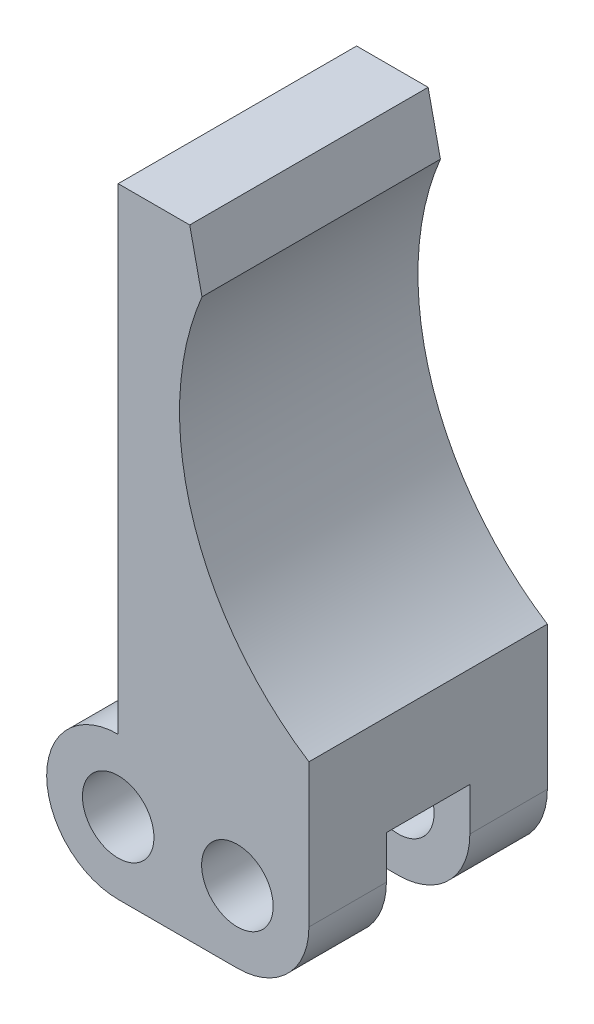
ISO-10303-21;
HEADER;
FILE_DESCRIPTION(('STEP AP214'),'2;1');
FILE_NAME('part.step','',(''),(''),'','','');
FILE_SCHEMA(('AUTOMOTIVE_DESIGN { 1 0 10303 214 1 1 1 1 }'));
ENDSEC;
DATA;
#1=APPLICATION_CONTEXT('core data for automotive mechanical design processes');
#2=APPLICATION_PROTOCOL_DEFINITION('international standard','automotive_design',2000,#1);
#3=PRODUCT_CONTEXT('',#1,'mechanical');
#4=PRODUCT('Part','Part','',(#3));
#5=PRODUCT_RELATED_PRODUCT_CATEGORY('part','',(#4));
#6=PRODUCT_DEFINITION_FORMATION('','',#4);
#7=PRODUCT_DEFINITION_CONTEXT('part definition',#1,'design');
#8=PRODUCT_DEFINITION('design','',#6,#7);
#9=PRODUCT_DEFINITION_SHAPE('','',#8);
#10=(LENGTH_UNIT() NAMED_UNIT(*) SI_UNIT(.MILLI.,.METRE.));
#11=(NAMED_UNIT(*) PLANE_ANGLE_UNIT() SI_UNIT($,.RADIAN.));
#12=(NAMED_UNIT(*) SI_UNIT($,.STERADIAN.) SOLID_ANGLE_UNIT());
#13=UNCERTAINTY_MEASURE_WITH_UNIT(LENGTH_MEASURE(1.E-05),#10,'distance_accuracy_value','');
#14=(GEOMETRIC_REPRESENTATION_CONTEXT(3) GLOBAL_UNCERTAINTY_ASSIGNED_CONTEXT((#13)) GLOBAL_UNIT_ASSIGNED_CONTEXT((#10,
#11,#12)) REPRESENTATION_CONTEXT('',''));
#15=CARTESIAN_POINT('',(0.,0.,0.));
#16=DIRECTION('',(0.,0.,1.));
#17=DIRECTION('',(1.,0.,0.));
#18=AXIS2_PLACEMENT_3D('',#15,#16,#17);
#19=CARTESIAN_POINT('',(0.,3.,5.));
#20=DIRECTION('',(1.,0.,0.));
#21=DIRECTION('',(0.,0.,-1.));
#22=AXIS2_PLACEMENT_3D('',#19,#20,#21);
#23=PLANE('',#22);
#24=DIRECTION('',(0.,-1.,0.));
#25=VECTOR('',#24,1.);
#26=CARTESIAN_POINT('',(0.,3.,-1.75));
#27=LINE('',#26,#25);
#28=CARTESIAN_POINT('',(0.,3.5,-1.75));
#29=VERTEX_POINT('',#28);
#30=CARTESIAN_POINT('',(0.,3.,-1.75));
#31=VERTEX_POINT('',#30);
#32=EDGE_CURVE('E219',#29,#31,#27,.T.);
#33=ORIENTED_EDGE('',*,*,#32,.F.);
#34=DIRECTION('',(0.,0.,1.));
#35=VECTOR('',#34,1.);
#36=CARTESIAN_POINT('',(0.,3.5,-1.75));
#37=LINE('',#36,#35);
#38=CARTESIAN_POINT('',(0.,3.5,1.75));
#39=VERTEX_POINT('',#38);
#40=EDGE_CURVE('E247',#29,#39,#37,.T.);
#41=ORIENTED_EDGE('',*,*,#40,.T.);
#42=DIRECTION('',(0.,-1.,0.));
#43=VECTOR('',#42,1.);
#44=CARTESIAN_POINT('',(0.,3.,1.75));
#45=LINE('',#44,#43);
#46=CARTESIAN_POINT('',(0.,3.,1.75));
#47=VERTEX_POINT('',#46);
#48=EDGE_CURVE('E236',#39,#47,#45,.T.);
#49=ORIENTED_EDGE('',*,*,#48,.T.);
#50=DIRECTION('',(0.,0.,-1.));
#51=VECTOR('',#50,1.);
#52=CARTESIAN_POINT('',(0.,3.,5.));
#53=LINE('',#52,#51);
#54=CARTESIAN_POINT('',(0.,3.,5.));
#55=VERTEX_POINT('',#54);
#56=EDGE_CURVE('E173',#55,#47,#53,.T.);
#57=ORIENTED_EDGE('',*,*,#56,.F.);
#58=DIRECTION('',(0.,-1.,0.));
#59=VECTOR('',#58,1.);
#60=CARTESIAN_POINT('',(0.,3.,5.));
#61=LINE('',#60,#59);
#62=CARTESIAN_POINT('',(0.,23.,5.));
#63=VERTEX_POINT('',#62);
#64=EDGE_CURVE('E202',#63,#55,#61,.T.);
#65=ORIENTED_EDGE('',*,*,#64,.F.);
#66=DIRECTION('',(0.,0.,-1.));
#67=VECTOR('',#66,1.);
#68=CARTESIAN_POINT('',(0.,23.,5.));
#69=LINE('',#68,#67);
#70=CARTESIAN_POINT('',(0.,23.,-5.));
#71=VERTEX_POINT('',#70);
#72=EDGE_CURVE('E176',#63,#71,#69,.T.);
#73=ORIENTED_EDGE('',*,*,#72,.T.);
#74=DIRECTION('',(0.,-1.,0.));
#75=VECTOR('',#74,1.);
#76=CARTESIAN_POINT('',(0.,3.,-5.));
#77=LINE('',#76,#75);
#78=CARTESIAN_POINT('',(0.,3.,-5.));
#79=VERTEX_POINT('',#78);
#80=EDGE_CURVE('E153',#71,#79,#77,.T.);
#81=ORIENTED_EDGE('',*,*,#80,.T.);
#82=EDGE_CURVE('E172',#31,#79,#53,.T.);
#83=ORIENTED_EDGE('',*,*,#82,.F.);
#84=EDGE_LOOP('',(#33,#41,#49,#57,#65,#73,#81,#83));
#85=FACE_BOUND('',#84,.T.);
#86=ADVANCED_FACE('F32',(#85),#23,.F.);
#87=CARTESIAN_POINT('',(0.,0.,5.));
#88=DIRECTION('',(0.,0.,-1.));
#89=DIRECTION('',(-1.,0.,0.));
#90=AXIS2_PLACEMENT_3D('',#87,#88,#89);
#91=CYLINDRICAL_SURFACE('',#90,3.);
#92=CARTESIAN_POINT('',(0.,0.,-1.75));
#93=DIRECTION('',(0.,0.,1.));
#94=DIRECTION('',(1.,0.,0.));
#95=AXIS2_PLACEMENT_3D('',#92,#93,#94);
#96=CIRCLE('',#95,3.);
#97=CARTESIAN_POINT('',(0.,-3.,-1.75));
#98=VERTEX_POINT('',#97);
#99=EDGE_CURVE('E224',#31,#98,#96,.T.);
#100=ORIENTED_EDGE('',*,*,#99,.F.);
#101=ORIENTED_EDGE('',*,*,#82,.T.);
#102=CARTESIAN_POINT('',(0.,0.,-5.));
#103=DIRECTION('',(0.,0.,1.));
#104=DIRECTION('',(1.,0.,0.));
#105=AXIS2_PLACEMENT_3D('',#102,#103,#104);
#106=CIRCLE('',#105,3.);
#107=CARTESIAN_POINT('',(0.,-3.,-5.));
#108=VERTEX_POINT('',#107);
#109=EDGE_CURVE('E156',#79,#108,#106,.T.);
#110=ORIENTED_EDGE('',*,*,#109,.T.);
#111=DIRECTION('',(0.,0.,-1.));
#112=VECTOR('',#111,1.);
#113=CARTESIAN_POINT('',(0.,-3.,5.));
#114=LINE('',#113,#112);
#115=EDGE_CURVE('E134',#98,#108,#114,.T.);
#116=ORIENTED_EDGE('',*,*,#115,.F.);
#117=EDGE_LOOP('',(#100,#101,#110,#116));
#118=FACE_BOUND('',#117,.T.);
#119=ADVANCED_FACE('F292',(#118),#91,.T.);
#120=CARTESIAN_POINT('',(0.,-3.,5.));
#121=DIRECTION('',(0.,1.,0.));
#122=DIRECTION('',(-1.,0.,0.));
#123=AXIS2_PLACEMENT_3D('',#120,#121,#122);
#124=PLANE('',#123);
#125=DIRECTION('',(1.,0.,0.));
#126=VECTOR('',#125,1.);
#127=CARTESIAN_POINT('',(0.,-3.,-1.75));
#128=LINE('',#127,#126);
#129=CARTESIAN_POINT('',(5.,-3.,-1.75));
#130=VERTEX_POINT('',#129);
#131=EDGE_CURVE('E227',#98,#130,#128,.T.);
#132=ORIENTED_EDGE('',*,*,#131,.F.);
#133=ORIENTED_EDGE('',*,*,#115,.T.);
#134=DIRECTION('',(1.,0.,0.));
#135=VECTOR('',#134,1.);
#136=CARTESIAN_POINT('',(0.,-3.,-5.));
#137=LINE('',#136,#135);
#138=CARTESIAN_POINT('',(5.,-3.,-5.));
#139=VERTEX_POINT('',#138);
#140=EDGE_CURVE('E159',#108,#139,#137,.T.);
#141=ORIENTED_EDGE('',*,*,#140,.T.);
#142=DIRECTION('',(0.,0.,-1.));
#143=VECTOR('',#142,1.);
#144=CARTESIAN_POINT('',(5.,-3.,5.));
#145=LINE('',#144,#143);
#146=EDGE_CURVE('E135',#130,#139,#145,.T.);
#147=ORIENTED_EDGE('',*,*,#146,.F.);
#148=EDGE_LOOP('',(#132,#133,#141,#147));
#149=FACE_BOUND('',#148,.T.);
#150=ADVANCED_FACE('F296',(#149),#124,.F.);
#151=CARTESIAN_POINT('',(5.,0.,5.));
#152=DIRECTION('',(0.,0.,-1.));
#153=DIRECTION('',(-1.,0.,0.));
#154=AXIS2_PLACEMENT_3D('',#151,#152,#153);
#155=CYLINDRICAL_SURFACE('',#154,3.);
#156=CARTESIAN_POINT('',(5.,0.,-1.75));
#157=DIRECTION('',(0.,0.,1.));
#158=DIRECTION('',(1.,0.,0.));
#159=AXIS2_PLACEMENT_3D('',#156,#157,#158);
#160=CIRCLE('',#159,3.);
#161=CARTESIAN_POINT('',(8.,0.,-1.75));
#162=VERTEX_POINT('',#161);
#163=EDGE_CURVE('E230',#130,#162,#160,.T.);
#164=ORIENTED_EDGE('',*,*,#163,.F.);
#165=ORIENTED_EDGE('',*,*,#146,.T.);
#166=CARTESIAN_POINT('',(5.,0.,-5.));
#167=DIRECTION('',(0.,0.,1.));
#168=DIRECTION('',(1.,0.,0.));
#169=AXIS2_PLACEMENT_3D('',#166,#167,#168);
#170=CIRCLE('',#169,3.);
#171=CARTESIAN_POINT('',(8.,0.,-5.));
#172=VERTEX_POINT('',#171);
#173=EDGE_CURVE('E162',#139,#172,#170,.T.);
#174=ORIENTED_EDGE('',*,*,#173,.T.);
#175=DIRECTION('',(0.,0.,-1.));
#176=VECTOR('',#175,1.);
#177=CARTESIAN_POINT('',(8.,0.,5.));
#178=LINE('',#177,#176);
#179=EDGE_CURVE('E168',#162,#172,#178,.T.);
#180=ORIENTED_EDGE('',*,*,#179,.F.);
#181=EDGE_LOOP('',(#164,#165,#174,#180));
#182=FACE_BOUND('',#181,.T.);
#183=ADVANCED_FACE('F304',(#182),#155,.T.);
#184=CARTESIAN_POINT('',(8.,0.,5.));
#185=DIRECTION('',(-1.,0.,0.));
#186=DIRECTION('',(0.,0.,1.));
#187=AXIS2_PLACEMENT_3D('',#184,#185,#186);
#188=PLANE('',#187);
#189=DIRECTION('',(0.,1.,0.));
#190=VECTOR('',#189,1.);
#191=CARTESIAN_POINT('',(8.,0.,-1.75));
#192=LINE('',#191,#190);
#193=CARTESIAN_POINT('',(8.,1.802775637732,-1.75));
#194=VERTEX_POINT('',#193);
#195=EDGE_CURVE('E233',#162,#194,#192,.T.);
#196=ORIENTED_EDGE('',*,*,#195,.F.);
#197=ORIENTED_EDGE('',*,*,#179,.T.);
#198=DIRECTION('',(0.,1.,0.));
#199=VECTOR('',#198,1.);
#200=CARTESIAN_POINT('',(8.,0.,-5.));
#201=LINE('',#200,#199);
#202=CARTESIAN_POINT('',(8.,6.,-5.));
#203=VERTEX_POINT('',#202);
#204=EDGE_CURVE('E88',#172,#203,#201,.T.);
#205=ORIENTED_EDGE('',*,*,#204,.T.);
#206=DIRECTION('',(0.,0.,-1.));
#207=VECTOR('',#206,1.);
#208=CARTESIAN_POINT('',(8.,6.,5.));
#209=LINE('',#208,#207);
#210=CARTESIAN_POINT('',(8.,6.,5.));
#211=VERTEX_POINT('',#210);
#212=EDGE_CURVE('E141',#211,#203,#209,.T.);
#213=ORIENTED_EDGE('',*,*,#212,.F.);
#214=DIRECTION('',(0.,1.,0.));
#215=VECTOR('',#214,1.);
#216=CARTESIAN_POINT('',(8.,0.,5.));
#217=LINE('',#216,#215);
#218=CARTESIAN_POINT('',(8.,0.,5.));
#219=VERTEX_POINT('',#218);
#220=EDGE_CURVE('E56',#219,#211,#217,.T.);
#221=ORIENTED_EDGE('',*,*,#220,.F.);
#222=CARTESIAN_POINT('',(8.,0.,1.75));
#223=VERTEX_POINT('',#222);
#224=EDGE_CURVE('E139',#219,#223,#178,.T.);
#225=ORIENTED_EDGE('',*,*,#224,.T.);
#226=DIRECTION('',(0.,1.,0.));
#227=VECTOR('',#226,1.);
#228=CARTESIAN_POINT('',(8.,0.,1.75));
#229=LINE('',#228,#227);
#230=CARTESIAN_POINT('',(8.,1.802775637732,1.75));
#231=VERTEX_POINT('',#230);
#232=EDGE_CURVE('E244',#223,#231,#229,.T.);
#233=ORIENTED_EDGE('',*,*,#232,.T.);
#234=DIRECTION('',(0.,0.,1.));
#235=VECTOR('',#234,1.);
#236=CARTESIAN_POINT('',(8.,1.802775637732,-1.75));
#237=LINE('',#236,#235);
#238=EDGE_CURVE('E11',#231,#194,#237,.F.);
#239=ORIENTED_EDGE('',*,*,#238,.T.);
#240=EDGE_LOOP('',(#196,#197,#205,#213,#221,#225,#233,#239));
#241=FACE_BOUND('',#240,.T.);
#242=ADVANCED_FACE('F307',(#241),#188,.F.);
#243=CARTESIAN_POINT('',(0.,0.,5.));
#244=DIRECTION('',(0.,0.,-1.));
#245=DIRECTION('',(-1.,0.,0.));
#246=AXIS2_PLACEMENT_3D('',#243,#244,#245);
#247=CYLINDRICAL_SURFACE('',#246,1.5);
#248=CARTESIAN_POINT('',(0.,0.,-5.));
#249=DIRECTION('',(0.,0.,1.));
#250=DIRECTION('',(1.,0.,0.));
#251=AXIS2_PLACEMENT_3D('',#248,#249,#250);
#252=CIRCLE('',#251,1.5);
#253=CARTESIAN_POINT('',(1.5,0.,-5.));
#254=VERTEX_POINT('',#253);
#255=EDGE_CURVE('E210',#254,#254,#252,.T.);
#256=ORIENTED_EDGE('',*,*,#255,.F.);
#257=EDGE_LOOP('',(#256));
#258=FACE_BOUND('',#257,.T.);
#259=CARTESIAN_POINT('',(0.,0.,-1.75));
#260=DIRECTION('',(0.,0.,1.));
#261=DIRECTION('',(1.,0.,0.));
#262=AXIS2_PLACEMENT_3D('',#259,#260,#261);
#263=CIRCLE('',#262,1.5);
#264=CARTESIAN_POINT('',(1.5,0.,-1.75));
#265=VERTEX_POINT('',#264);
#266=EDGE_CURVE('E259',#265,#265,#263,.T.);
#267=ORIENTED_EDGE('',*,*,#266,.T.);
#268=EDGE_LOOP('',(#267));
#269=FACE_BOUND('',#268,.T.);
#270=ADVANCED_FACE('F365',(#258,#269),#247,.F.);
#271=CARTESIAN_POINT('',(5.,0.,5.));
#272=DIRECTION('',(0.,0.,-1.));
#273=DIRECTION('',(-1.,0.,0.));
#274=AXIS2_PLACEMENT_3D('',#271,#272,#273);
#275=CYLINDRICAL_SURFACE('',#274,1.5);
#276=CARTESIAN_POINT('',(5.,0.,-5.));
#277=DIRECTION('',(0.,0.,1.));
#278=DIRECTION('',(1.,0.,0.));
#279=AXIS2_PLACEMENT_3D('',#276,#277,#278);
#280=CIRCLE('',#279,1.5);
#281=CARTESIAN_POINT('',(6.5,0.,-5.));
#282=VERTEX_POINT('',#281);
#283=EDGE_CURVE('E216',#282,#282,#280,.T.);
#284=ORIENTED_EDGE('',*,*,#283,.F.);
#285=EDGE_LOOP('',(#284));
#286=FACE_BOUND('',#285,.T.);
#287=CARTESIAN_POINT('',(5.,0.,-1.75));
#288=DIRECTION('',(0.,0.,1.));
#289=DIRECTION('',(1.,0.,0.));
#290=AXIS2_PLACEMENT_3D('',#287,#288,#289);
#291=CIRCLE('',#290,1.5);
#292=CARTESIAN_POINT('',(6.5,0.,-1.75));
#293=VERTEX_POINT('',#292);
#294=EDGE_CURVE('E267',#293,#293,#291,.T.);
#295=ORIENTED_EDGE('',*,*,#294,.T.);
#296=EDGE_LOOP('',(#295));
#297=FACE_BOUND('',#296,.T.);
#298=ADVANCED_FACE('F276',(#286,#297),#275,.F.);
#299=CARTESIAN_POINT('',(14.5,16.,5.));
#300=DIRECTION('',(0.,0.,-1.));
#301=DIRECTION('',(-1.,0.,0.));
#302=AXIS2_PLACEMENT_3D('',#299,#300,#301);
#303=PLANE('',#302);
#304=CARTESIAN_POINT('',(0.,0.,5.));
#305=DIRECTION('',(0.,0.,1.));
#306=DIRECTION('',(1.,0.,0.));
#307=AXIS2_PLACEMENT_3D('',#304,#305,#306);
#308=CIRCLE('',#307,1.5);
#309=CARTESIAN_POINT('',(1.5,0.,5.));
#310=VERTEX_POINT('',#309);
#311=EDGE_CURVE('E149',#310,#310,#308,.T.);
#312=ORIENTED_EDGE('',*,*,#311,.F.);
#313=EDGE_LOOP('',(#312));
#314=FACE_BOUND('',#313,.T.);
#315=CARTESIAN_POINT('',(14.5,16.,5.));
#316=DIRECTION('',(0.,0.,-1.));
#317=DIRECTION('',(-1.,0.,0.));
#318=AXIS2_PLACEMENT_3D('',#315,#316,#317);
#319=CIRCLE('',#318,11.9268604418766);
#320=CARTESIAN_POINT('',(3.51533248139818,20.6461897836587,5.));
#321=VERTEX_POINT('',#320);
#322=EDGE_CURVE('E166',#211,#321,#319,.T.);
#323=ORIENTED_EDGE('',*,*,#322,.T.);
#324=DIRECTION('',(-0.213869754732396,0.976862184758272,0.));
#325=VECTOR('',#324,1.);
#326=CARTESIAN_POINT('',(3.,23.,5.));
#327=LINE('',#326,#325);
#328=CARTESIAN_POINT('',(3.,23.,5.));
#329=VERTEX_POINT('',#328);
#330=EDGE_CURVE('E97',#321,#329,#327,.T.);
#331=ORIENTED_EDGE('',*,*,#330,.T.);
#332=DIRECTION('',(-1.,0.,0.));
#333=VECTOR('',#332,1.);
#334=CARTESIAN_POINT('',(0.,23.,5.));
#335=LINE('',#334,#333);
#336=EDGE_CURVE('E204',#329,#63,#335,.T.);
#337=ORIENTED_EDGE('',*,*,#336,.T.);
#338=ORIENTED_EDGE('',*,*,#64,.T.);
#339=CARTESIAN_POINT('',(0.,0.,5.));
#340=DIRECTION('',(0.,0.,1.));
#341=DIRECTION('',(1.,0.,0.));
#342=AXIS2_PLACEMENT_3D('',#339,#340,#341);
#343=CIRCLE('',#342,3.);
#344=CARTESIAN_POINT('',(0.,-3.,5.));
#345=VERTEX_POINT('',#344);
#346=EDGE_CURVE('E120',#55,#345,#343,.T.);
#347=ORIENTED_EDGE('',*,*,#346,.T.);
#348=DIRECTION('',(1.,0.,0.));
#349=VECTOR('',#348,1.);
#350=CARTESIAN_POINT('',(0.,-3.,5.));
#351=LINE('',#350,#349);
#352=CARTESIAN_POINT('',(5.,-3.,5.));
#353=VERTEX_POINT('',#352);
#354=EDGE_CURVE('E112',#345,#353,#351,.T.);
#355=ORIENTED_EDGE('',*,*,#354,.T.);
#356=CARTESIAN_POINT('',(5.,0.,5.));
#357=DIRECTION('',(0.,0.,1.));
#358=DIRECTION('',(1.,0.,0.));
#359=AXIS2_PLACEMENT_3D('',#356,#357,#358);
#360=CIRCLE('',#359,3.);
#361=EDGE_CURVE('E117',#353,#219,#360,.T.);
#362=ORIENTED_EDGE('',*,*,#361,.T.);
#363=ORIENTED_EDGE('',*,*,#220,.T.);
#364=EDGE_LOOP('',(#323,#331,#337,#338,#347,#355,#362,#363));
#365=FACE_BOUND('',#364,.T.);
#366=CARTESIAN_POINT('',(5.,0.,5.));
#367=DIRECTION('',(0.,0.,1.));
#368=DIRECTION('',(1.,0.,0.));
#369=AXIS2_PLACEMENT_3D('',#366,#367,#368);
#370=CIRCLE('',#369,1.5);
#371=CARTESIAN_POINT('',(6.5,0.,5.));
#372=VERTEX_POINT('',#371);
#373=EDGE_CURVE('E213',#372,#372,#370,.T.);
#374=ORIENTED_EDGE('',*,*,#373,.F.);
#375=EDGE_LOOP('',(#374));
#376=FACE_BOUND('',#375,.T.);
#377=ADVANCED_FACE('F114',(#314,#365,#376),#303,.F.);
#378=CARTESIAN_POINT('',(14.5,16.,-5.));
#379=DIRECTION('',(0.,0.,-1.));
#380=DIRECTION('',(-1.,0.,0.));
#381=AXIS2_PLACEMENT_3D('',#378,#379,#380);
#382=PLANE('',#381);
#383=ORIENTED_EDGE('',*,*,#255,.T.);
#384=EDGE_LOOP('',(#383));
#385=FACE_BOUND('',#384,.T.);
#386=CARTESIAN_POINT('',(14.5,16.,-5.));
#387=DIRECTION('',(0.,0.,-1.));
#388=DIRECTION('',(-1.,0.,0.));
#389=AXIS2_PLACEMENT_3D('',#386,#387,#388);
#390=CIRCLE('',#389,11.9268604418766);
#391=CARTESIAN_POINT('',(3.51533248139818,20.6461897836587,-5.));
#392=VERTEX_POINT('',#391);
#393=EDGE_CURVE('E145',#203,#392,#390,.T.);
#394=ORIENTED_EDGE('',*,*,#393,.F.);
#395=ORIENTED_EDGE('',*,*,#204,.F.);
#396=ORIENTED_EDGE('',*,*,#173,.F.);
#397=ORIENTED_EDGE('',*,*,#140,.F.);
#398=ORIENTED_EDGE('',*,*,#109,.F.);
#399=ORIENTED_EDGE('',*,*,#80,.F.);
#400=DIRECTION('',(-1.,0.,0.));
#401=VECTOR('',#400,1.);
#402=CARTESIAN_POINT('',(0.,23.,-5.));
#403=LINE('',#402,#401);
#404=CARTESIAN_POINT('',(3.,23.,-5.));
#405=VERTEX_POINT('',#404);
#406=EDGE_CURVE('E151',#405,#71,#403,.T.);
#407=ORIENTED_EDGE('',*,*,#406,.F.);
#408=DIRECTION('',(-0.213869754732396,0.976862184758272,0.));
#409=VECTOR('',#408,1.);
#410=CARTESIAN_POINT('',(3.,23.,-5.));
#411=LINE('',#410,#409);
#412=EDGE_CURVE('E148',#392,#405,#411,.T.);
#413=ORIENTED_EDGE('',*,*,#412,.F.);
#414=EDGE_LOOP('',(#394,#395,#396,#397,#398,#399,#407,#413));
#415=FACE_BOUND('',#414,.T.);
#416=ORIENTED_EDGE('',*,*,#283,.T.);
#417=EDGE_LOOP('',(#416));
#418=FACE_BOUND('',#417,.T.);
#419=ADVANCED_FACE('F187',(#385,#415,#418),#382,.T.);
#420=CARTESIAN_POINT('',(14.5,16.,5.));
#421=DIRECTION('',(0.,0.,-1.));
#422=DIRECTION('',(-1.,0.,0.));
#423=AXIS2_PLACEMENT_3D('',#420,#421,#422);
#424=CYLINDRICAL_SURFACE('',#423,11.9268604418766);
#425=ORIENTED_EDGE('',*,*,#393,.T.);
#426=DIRECTION('',(0.,0.,-1.));
#427=VECTOR('',#426,1.);
#428=CARTESIAN_POINT('',(3.51533248139818,20.6461897836587,5.));
#429=LINE('',#428,#427);
#430=EDGE_CURVE('E40',#321,#392,#429,.T.);
#431=ORIENTED_EDGE('',*,*,#430,.F.);
#432=ORIENTED_EDGE('',*,*,#322,.F.);
#433=ORIENTED_EDGE('',*,*,#212,.T.);
#434=EDGE_LOOP('',(#425,#431,#432,#433));
#435=FACE_BOUND('',#434,.T.);
#436=ADVANCED_FACE('F34',(#435),#424,.F.);
#437=CARTESIAN_POINT('',(3.,23.,5.));
#438=DIRECTION('',(-0.976862184758272,-0.213869754732396,0.));
#439=DIRECTION('',(0.213869754732396,-0.976862184758272,0.));
#440=AXIS2_PLACEMENT_3D('',#437,#438,#439);
#441=PLANE('',#440);
#442=ORIENTED_EDGE('',*,*,#412,.T.);
#443=DIRECTION('',(0.,0.,-1.));
#444=VECTOR('',#443,1.);
#445=CARTESIAN_POINT('',(3.,23.,5.));
#446=LINE('',#445,#444);
#447=EDGE_CURVE('E179',#329,#405,#446,.T.);
#448=ORIENTED_EDGE('',*,*,#447,.F.);
#449=ORIENTED_EDGE('',*,*,#330,.F.);
#450=ORIENTED_EDGE('',*,*,#430,.T.);
#451=EDGE_LOOP('',(#442,#448,#449,#450));
#452=FACE_BOUND('',#451,.T.);
#453=ADVANCED_FACE('F182',(#452),#441,.F.);
#454=CARTESIAN_POINT('',(0.,23.,5.));
#455=DIRECTION('',(0.,-1.,0.));
#456=DIRECTION('',(0.,0.,-1.));
#457=AXIS2_PLACEMENT_3D('',#454,#455,#456);
#458=PLANE('',#457);
#459=ORIENTED_EDGE('',*,*,#406,.T.);
#460=ORIENTED_EDGE('',*,*,#72,.F.);
#461=ORIENTED_EDGE('',*,*,#336,.F.);
#462=ORIENTED_EDGE('',*,*,#447,.T.);
#463=EDGE_LOOP('',(#459,#460,#461,#462));
#464=FACE_BOUND('',#463,.T.);
#465=ADVANCED_FACE('F195',(#464),#458,.F.);
#466=ORIENTED_EDGE('',*,*,#56,.T.);
#467=CARTESIAN_POINT('',(0.,0.,1.75));
#468=DIRECTION('',(0.,0.,1.));
#469=DIRECTION('',(1.,0.,0.));
#470=AXIS2_PLACEMENT_3D('',#467,#468,#469);
#471=CIRCLE('',#470,3.);
#472=CARTESIAN_POINT('',(0.,-3.,1.75));
#473=VERTEX_POINT('',#472);
#474=EDGE_CURVE('E238',#47,#473,#471,.T.);
#475=ORIENTED_EDGE('',*,*,#474,.T.);
#476=EDGE_CURVE('E170',#345,#473,#114,.T.);
#477=ORIENTED_EDGE('',*,*,#476,.F.);
#478=ORIENTED_EDGE('',*,*,#346,.F.);
#479=EDGE_LOOP('',(#466,#475,#477,#478));
#480=FACE_BOUND('',#479,.T.);
#481=ADVANCED_FACE('F333',(#480),#91,.T.);
#482=ORIENTED_EDGE('',*,*,#476,.T.);
#483=DIRECTION('',(1.,0.,0.));
#484=VECTOR('',#483,1.);
#485=CARTESIAN_POINT('',(0.,-3.,1.75));
#486=LINE('',#485,#484);
#487=CARTESIAN_POINT('',(5.,-3.,1.75));
#488=VERTEX_POINT('',#487);
#489=EDGE_CURVE('E131',#473,#488,#486,.T.);
#490=ORIENTED_EDGE('',*,*,#489,.T.);
#491=EDGE_CURVE('E127',#353,#488,#145,.T.);
#492=ORIENTED_EDGE('',*,*,#491,.F.);
#493=ORIENTED_EDGE('',*,*,#354,.F.);
#494=EDGE_LOOP('',(#482,#490,#492,#493));
#495=FACE_BOUND('',#494,.T.);
#496=ADVANCED_FACE('F128',(#495),#124,.F.);
#497=ORIENTED_EDGE('',*,*,#491,.T.);
#498=CARTESIAN_POINT('',(5.,0.,1.75));
#499=DIRECTION('',(0.,0.,1.));
#500=DIRECTION('',(1.,0.,0.));
#501=AXIS2_PLACEMENT_3D('',#498,#499,#500);
#502=CIRCLE('',#501,3.);
#503=EDGE_CURVE('E242',#488,#223,#502,.T.);
#504=ORIENTED_EDGE('',*,*,#503,.T.);
#505=ORIENTED_EDGE('',*,*,#224,.F.);
#506=ORIENTED_EDGE('',*,*,#361,.F.);
#507=EDGE_LOOP('',(#497,#504,#505,#506));
#508=FACE_BOUND('',#507,.T.);
#509=ADVANCED_FACE('F137',(#508),#155,.T.);
#510=CARTESIAN_POINT('',(0.,0.,1.75));
#511=DIRECTION('',(0.,0.,1.));
#512=DIRECTION('',(1.,0.,0.));
#513=AXIS2_PLACEMENT_3D('',#510,#511,#512);
#514=CIRCLE('',#513,1.5);
#515=CARTESIAN_POINT('',(1.5,0.,1.75));
#516=VERTEX_POINT('',#515);
#517=EDGE_CURVE('E264',#516,#516,#514,.T.);
#518=ORIENTED_EDGE('',*,*,#517,.F.);
#519=EDGE_LOOP('',(#518));
#520=FACE_BOUND('',#519,.T.);
#521=ORIENTED_EDGE('',*,*,#311,.T.);
#522=EDGE_LOOP('',(#521));
#523=FACE_BOUND('',#522,.T.);
#524=ADVANCED_FACE('F367',(#520,#523),#247,.F.);
#525=CARTESIAN_POINT('',(5.,0.,1.75));
#526=DIRECTION('',(0.,0.,1.));
#527=DIRECTION('',(1.,0.,0.));
#528=AXIS2_PLACEMENT_3D('',#525,#526,#527);
#529=CIRCLE('',#528,1.5);
#530=CARTESIAN_POINT('',(6.5,0.,1.75));
#531=VERTEX_POINT('',#530);
#532=EDGE_CURVE('E270',#531,#531,#529,.T.);
#533=ORIENTED_EDGE('',*,*,#532,.F.);
#534=EDGE_LOOP('',(#533));
#535=FACE_BOUND('',#534,.T.);
#536=ORIENTED_EDGE('',*,*,#373,.T.);
#537=EDGE_LOOP('',(#536));
#538=FACE_BOUND('',#537,.T.);
#539=ADVANCED_FACE('F371',(#535,#538),#275,.F.);
#540=CARTESIAN_POINT('',(5.,0.,-1.75));
#541=DIRECTION('',(0.,0.,1.));
#542=DIRECTION('',(1.,0.,0.));
#543=AXIS2_PLACEMENT_3D('',#540,#541,#542);
#544=CYLINDRICAL_SURFACE('',#543,3.5);
#545=CARTESIAN_POINT('',(5.,0.,1.75));
#546=DIRECTION('',(0.,0.,1.));
#547=DIRECTION('',(1.,0.,0.));
#548=AXIS2_PLACEMENT_3D('',#545,#546,#547);
#549=CIRCLE('',#548,3.5);
#550=CARTESIAN_POINT('',(5.,3.5,1.75));
#551=VERTEX_POINT('',#550);
#552=EDGE_CURVE('E47',#231,#551,#549,.T.);
#553=ORIENTED_EDGE('',*,*,#552,.T.);
#554=DIRECTION('',(0.,0.,1.));
#555=VECTOR('',#554,1.);
#556=CARTESIAN_POINT('',(5.,3.5,-1.75));
#557=LINE('',#556,#555);
#558=CARTESIAN_POINT('',(5.,3.5,-1.75));
#559=VERTEX_POINT('',#558);
#560=EDGE_CURVE('E248',#559,#551,#557,.T.);
#561=ORIENTED_EDGE('',*,*,#560,.F.);
#562=CARTESIAN_POINT('',(5.,0.,-1.75));
#563=DIRECTION('',(0.,0.,1.));
#564=DIRECTION('',(1.,0.,0.));
#565=AXIS2_PLACEMENT_3D('',#562,#563,#564);
#566=CIRCLE('',#565,3.5);
#567=EDGE_CURVE('E257',#194,#559,#566,.T.);
#568=ORIENTED_EDGE('',*,*,#567,.F.);
#569=ORIENTED_EDGE('',*,*,#238,.F.);
#570=EDGE_LOOP('',(#553,#561,#568,#569));
#571=FACE_BOUND('',#570,.T.);
#572=ADVANCED_FACE('F282',(#571),#544,.F.);
#573=CARTESIAN_POINT('',(5.,0.,-1.75));
#574=DIRECTION('',(0.,0.,1.));
#575=DIRECTION('',(1.,0.,0.));
#576=AXIS2_PLACEMENT_3D('',#573,#574,#575);
#577=PLANE('',#576);
#578=ORIENTED_EDGE('',*,*,#266,.F.);
#579=EDGE_LOOP('',(#578));
#580=FACE_BOUND('',#579,.T.);
#581=ORIENTED_EDGE('',*,*,#294,.F.);
#582=EDGE_LOOP('',(#581));
#583=FACE_BOUND('',#582,.T.);
#584=ORIENTED_EDGE('',*,*,#32,.T.);
#585=ORIENTED_EDGE('',*,*,#99,.T.);
#586=ORIENTED_EDGE('',*,*,#131,.T.);
#587=ORIENTED_EDGE('',*,*,#163,.T.);
#588=ORIENTED_EDGE('',*,*,#195,.T.);
#589=ORIENTED_EDGE('',*,*,#567,.T.);
#590=DIRECTION('',(-1.,0.,0.));
#591=VECTOR('',#590,1.);
#592=CARTESIAN_POINT('',(0.,3.5,-1.75));
#593=LINE('',#592,#591);
#594=EDGE_CURVE('E251',#559,#29,#593,.T.);
#595=ORIENTED_EDGE('',*,*,#594,.T.);
#596=EDGE_LOOP('',(#584,#585,#586,#587,#588,#589,#595));
#597=FACE_BOUND('',#596,.T.);
#598=ADVANCED_FACE('F278',(#580,#583,#597),#577,.T.);
#599=CARTESIAN_POINT('',(5.,0.,1.75));
#600=DIRECTION('',(0.,0.,1.));
#601=DIRECTION('',(1.,0.,0.));
#602=AXIS2_PLACEMENT_3D('',#599,#600,#601);
#603=PLANE('',#602);
#604=ORIENTED_EDGE('',*,*,#517,.T.);
#605=EDGE_LOOP('',(#604));
#606=FACE_BOUND('',#605,.T.);
#607=ORIENTED_EDGE('',*,*,#532,.T.);
#608=EDGE_LOOP('',(#607));
#609=FACE_BOUND('',#608,.T.);
#610=DIRECTION('',(-1.,0.,0.));
#611=VECTOR('',#610,1.);
#612=CARTESIAN_POINT('',(0.,3.5,1.75));
#613=LINE('',#612,#611);
#614=EDGE_CURVE('E254',#551,#39,#613,.T.);
#615=ORIENTED_EDGE('',*,*,#614,.F.);
#616=ORIENTED_EDGE('',*,*,#552,.F.);
#617=ORIENTED_EDGE('',*,*,#232,.F.);
#618=ORIENTED_EDGE('',*,*,#503,.F.);
#619=ORIENTED_EDGE('',*,*,#489,.F.);
#620=ORIENTED_EDGE('',*,*,#474,.F.);
#621=ORIENTED_EDGE('',*,*,#48,.F.);
#622=EDGE_LOOP('',(#615,#616,#617,#618,#619,#620,#621));
#623=FACE_BOUND('',#622,.T.);
#624=ADVANCED_FACE('F281',(#606,#609,#623),#603,.F.);
#625=CARTESIAN_POINT('',(0.,3.5,-1.75));
#626=DIRECTION('',(0.,1.,0.));
#627=DIRECTION('',(-1.,0.,0.));
#628=AXIS2_PLACEMENT_3D('',#625,#626,#627);
#629=PLANE('',#628);
#630=ORIENTED_EDGE('',*,*,#614,.T.);
#631=ORIENTED_EDGE('',*,*,#40,.F.);
#632=ORIENTED_EDGE('',*,*,#594,.F.);
#633=ORIENTED_EDGE('',*,*,#560,.T.);
#634=EDGE_LOOP('',(#630,#631,#632,#633));
#635=FACE_BOUND('',#634,.T.);
#636=ADVANCED_FACE('F319',(#635),#629,.F.);
#637=CLOSED_SHELL('',(#86,#119,#150,#183,#242,#270,#298,#377,#419,#436,#453,#465,#481,#496,#509,
#524,#539,#572,#598,#624,#636));
#638=MANIFOLD_SOLID_BREP('B2',#637);
#639=ADVANCED_BREP_SHAPE_REPRESENTATION('',(#18,#638),#14);
#640=SHAPE_DEFINITION_REPRESENTATION(#9,#639);
ENDSEC;
END-ISO-10303-21;
